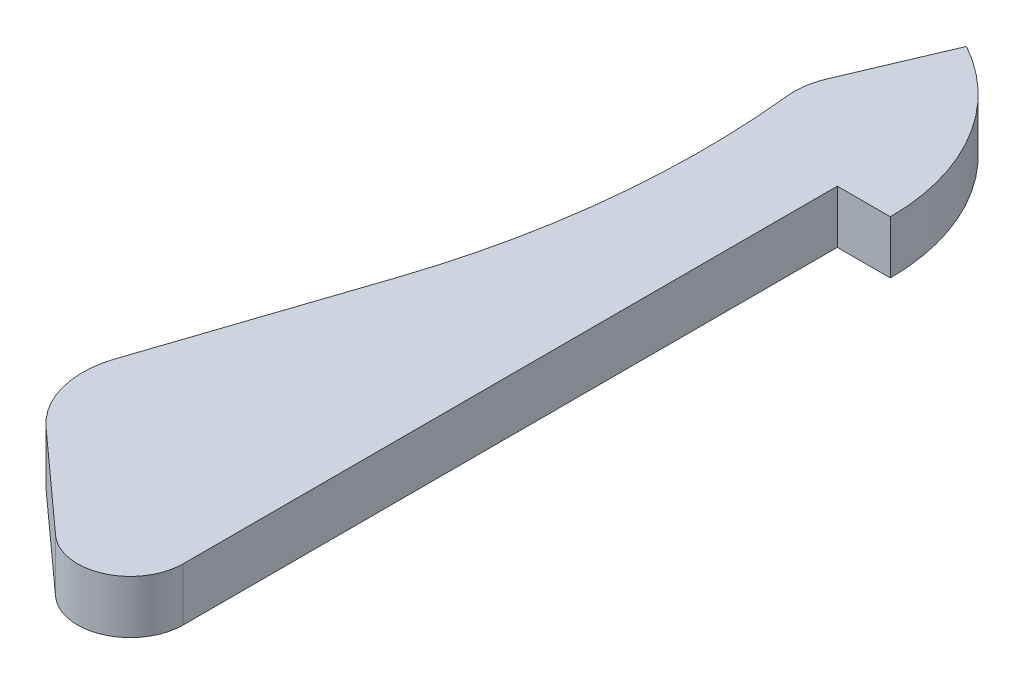
ISO-10303-21;
HEADER;
FILE_DESCRIPTION(('STEP AP214'),'2;1');
FILE_NAME('part.step','',(''),(''),'','','');
FILE_SCHEMA(('AUTOMOTIVE_DESIGN { 1 0 10303 214 1 1 1 1 }'));
ENDSEC;
DATA;
#1=APPLICATION_CONTEXT('core data for automotive mechanical design processes');
#2=APPLICATION_PROTOCOL_DEFINITION('international standard','automotive_design',2000,#1);
#3=PRODUCT_CONTEXT('',#1,'mechanical');
#4=PRODUCT('Part','Part','',(#3));
#5=PRODUCT_RELATED_PRODUCT_CATEGORY('part','',(#4));
#6=PRODUCT_DEFINITION_FORMATION('','',#4);
#7=PRODUCT_DEFINITION_CONTEXT('part definition',#1,'design');
#8=PRODUCT_DEFINITION('design','',#6,#7);
#9=PRODUCT_DEFINITION_SHAPE('','',#8);
#10=(LENGTH_UNIT() NAMED_UNIT(*) SI_UNIT(.MILLI.,.METRE.));
#11=(NAMED_UNIT(*) PLANE_ANGLE_UNIT() SI_UNIT($,.RADIAN.));
#12=(NAMED_UNIT(*) SI_UNIT($,.STERADIAN.) SOLID_ANGLE_UNIT());
#13=UNCERTAINTY_MEASURE_WITH_UNIT(LENGTH_MEASURE(1.E-05),#10,'distance_accuracy_value','');
#14=(GEOMETRIC_REPRESENTATION_CONTEXT(3) GLOBAL_UNCERTAINTY_ASSIGNED_CONTEXT((#13)) GLOBAL_UNIT_ASSIGNED_CONTEXT((#10,
#11,#12)) REPRESENTATION_CONTEXT('',''));
#15=CARTESIAN_POINT('',(0.,0.,0.));
#16=DIRECTION('',(0.,0.,1.));
#17=DIRECTION('',(1.,0.,0.));
#18=AXIS2_PLACEMENT_3D('',#15,#16,#17);
#19=CARTESIAN_POINT('',(0.,19.05,0.));
#20=DIRECTION('',(0.,0.,-1.));
#21=DIRECTION('',(-1.,0.,0.));
#22=AXIS2_PLACEMENT_3D('',#19,#20,#21);
#23=PLANE('',#22);
#24=DIRECTION('',(1.,0.,0.));
#25=VECTOR('',#24,1.);
#26=CARTESIAN_POINT('',(0.,0.,0.));
#27=LINE('',#26,#25);
#28=CARTESIAN_POINT('',(0.,0.,0.));
#29=VERTEX_POINT('',#28);
#30=CARTESIAN_POINT('',(19.05,0.,0.));
#31=VERTEX_POINT('',#30);
#32=EDGE_CURVE('E144',#29,#31,#27,.T.);
#33=ORIENTED_EDGE('',*,*,#32,.T.);
#34=DIRECTION('',(0.,-1.,0.));
#35=VECTOR('',#34,1.);
#36=CARTESIAN_POINT('',(19.05,19.05,0.));
#37=LINE('',#36,#35);
#38=CARTESIAN_POINT('',(19.05,19.05,0.));
#39=VERTEX_POINT('',#38);
#40=EDGE_CURVE('E11',#39,#31,#37,.T.);
#41=ORIENTED_EDGE('',*,*,#40,.F.);
#42=DIRECTION('',(1.,0.,0.));
#43=VECTOR('',#42,1.);
#44=CARTESIAN_POINT('',(0.,19.05,0.));
#45=LINE('',#44,#43);
#46=CARTESIAN_POINT('',(0.,19.05,0.));
#47=VERTEX_POINT('',#46);
#48=EDGE_CURVE('E163',#47,#39,#45,.T.);
#49=ORIENTED_EDGE('',*,*,#48,.F.);
#50=DIRECTION('',(0.,-1.,0.));
#51=VECTOR('',#50,1.);
#52=CARTESIAN_POINT('',(0.,19.05,0.));
#53=LINE('',#52,#51);
#54=EDGE_CURVE('E140',#47,#29,#53,.T.);
#55=ORIENTED_EDGE('',*,*,#54,.T.);
#56=EDGE_LOOP('',(#33,#41,#49,#55));
#57=FACE_BOUND('',#56,.T.);
#58=ADVANCED_FACE('F33',(#57),#23,.F.);
#59=CARTESIAN_POINT('',(-57.15,19.05,0.));
#60=DIRECTION('',(0.,-1.,0.));
#61=DIRECTION('',(0.,0.,-1.));
#62=AXIS2_PLACEMENT_3D('',#59,#60,#61);
#63=CYLINDRICAL_SURFACE('',#62,76.2);
#64=CARTESIAN_POINT('',(-57.15,0.,0.));
#65=DIRECTION('',(0.,1.,0.));
#66=DIRECTION('',(0.,0.,1.));
#67=AXIS2_PLACEMENT_3D('',#64,#65,#66);
#68=CIRCLE('',#67,76.2);
#69=CARTESIAN_POINT('',(-20.259833627042,0.,-66.6749999998161));
#70=VERTEX_POINT('',#69);
#71=EDGE_CURVE('E147',#31,#70,#68,.T.);
#72=ORIENTED_EDGE('',*,*,#71,.T.);
#73=DIRECTION('',(0.,-1.,0.));
#74=VECTOR('',#73,1.);
#75=CARTESIAN_POINT('',(-20.259833627042,19.05,-66.6749999998161));
#76=LINE('',#75,#74);
#77=CARTESIAN_POINT('',(-20.259833627042,19.05,-66.6749999998161));
#78=VERTEX_POINT('',#77);
#79=EDGE_CURVE('E41',#78,#70,#76,.T.);
#80=ORIENTED_EDGE('',*,*,#79,.F.);
#81=CARTESIAN_POINT('',(-57.15,19.05,0.));
#82=DIRECTION('',(0.,1.,0.));
#83=DIRECTION('',(0.,0.,1.));
#84=AXIS2_PLACEMENT_3D('',#81,#82,#83);
#85=CIRCLE('',#84,76.2);
#86=EDGE_CURVE('E99',#39,#78,#85,.T.);
#87=ORIENTED_EDGE('',*,*,#86,.F.);
#88=ORIENTED_EDGE('',*,*,#40,.T.);
#89=EDGE_LOOP('',(#72,#80,#87,#88));
#90=FACE_BOUND('',#89,.T.);
#91=ADVANCED_FACE('F254',(#90),#63,.T.);
#92=CARTESIAN_POINT('',(-20.259833627042,19.05,-66.6749999998161));
#93=DIRECTION('',(0.920287164315627,0.,0.391243575277475));
#94=DIRECTION('',(0.391243575277475,0.,-0.920287164315627));
#95=AXIS2_PLACEMENT_3D('',#92,#93,#94);
#96=PLANE('',#95);
#97=DIRECTION('',(-0.391243575277475,0.,0.920287164315627));
#98=VECTOR('',#97,1.);
#99=CARTESIAN_POINT('',(-20.259833627042,0.,-66.6749999998161));
#100=LINE('',#99,#98);
#101=CARTESIAN_POINT('',(-35.1662138451139,0.,-31.6120590393907));
#102=VERTEX_POINT('',#101);
#103=EDGE_CURVE('E150',#70,#102,#100,.T.);
#104=ORIENTED_EDGE('',*,*,#103,.T.);
#105=DIRECTION('',(0.,-1.,0.));
#106=VECTOR('',#105,1.);
#107=CARTESIAN_POINT('',(-35.1662138451139,19.05,-31.6120590393907));
#108=LINE('',#107,#106);
#109=CARTESIAN_POINT('',(-35.1662138451139,19.05,-31.6120590393907));
#110=VERTEX_POINT('',#109);
#111=EDGE_CURVE('E176',#110,#102,#108,.T.);
#112=ORIENTED_EDGE('',*,*,#111,.F.);
#113=DIRECTION('',(-0.391243575277475,0.,0.920287164315627));
#114=VECTOR('',#113,1.);
#115=CARTESIAN_POINT('',(-20.259833627042,19.05,-66.6749999998161));
#116=LINE('',#115,#114);
#117=EDGE_CURVE('E184',#78,#110,#116,.T.);
#118=ORIENTED_EDGE('',*,*,#117,.F.);
#119=ORIENTED_EDGE('',*,*,#79,.T.);
#120=EDGE_LOOP('',(#104,#112,#118,#119));
#121=FACE_BOUND('',#120,.T.);
#122=ADVANCED_FACE('F182',(#121),#96,.F.);
#123=CARTESIAN_POINT('',(-11.790919871497,19.05,-21.6744722273428));
#124=DIRECTION('',(0.,-1.,0.));
#125=DIRECTION('',(0.,0.,-1.));
#126=AXIS2_PLACEMENT_3D('',#123,#124,#125);
#127=CYLINDRICAL_SURFACE('',#126,25.4);
#128=CARTESIAN_POINT('',(-11.790919871497,0.,-21.6744722273428));
#129=DIRECTION('',(0.,1.,0.));
#130=DIRECTION('',(0.,0.,1.));
#131=AXIS2_PLACEMENT_3D('',#128,#129,#130);
#132=CIRCLE('',#131,25.4);
#133=CARTESIAN_POINT('',(-37.0485453596706,0.,-18.9888894788209));
#134=VERTEX_POINT('',#133);
#135=EDGE_CURVE('E152',#102,#134,#132,.T.);
#136=ORIENTED_EDGE('',*,*,#135,.T.);
#137=DIRECTION('',(0.,-1.,0.));
#138=VECTOR('',#137,1.);
#139=CARTESIAN_POINT('',(-37.0485453596706,19.05,-18.9888894788209));
#140=LINE('',#139,#138);
#141=CARTESIAN_POINT('',(-37.0485453596706,19.05,-18.9888894788209));
#142=VERTEX_POINT('',#141);
#143=EDGE_CURVE('E173',#142,#134,#140,.T.);
#144=ORIENTED_EDGE('',*,*,#143,.F.);
#145=CARTESIAN_POINT('',(-11.790919871497,19.05,-21.6744722273428));
#146=DIRECTION('',(0.,1.,0.));
#147=DIRECTION('',(0.,0.,1.));
#148=AXIS2_PLACEMENT_3D('',#145,#146,#147);
#149=CIRCLE('',#148,25.4);
#150=EDGE_CURVE('E202',#110,#142,#149,.T.);
#151=ORIENTED_EDGE('',*,*,#150,.F.);
#152=ORIENTED_EDGE('',*,*,#111,.T.);
#153=EDGE_LOOP('',(#136,#144,#151,#152));
#154=FACE_BOUND('',#153,.T.);
#155=ADVANCED_FACE('F193',(#154),#127,.T.);
#156=CARTESIAN_POINT('',(-336.194312345896,19.05,12.8185625513681));
#157=DIRECTION('',(0.,-1.,0.));
#158=DIRECTION('',(0.,0.,-1.));
#159=AXIS2_PLACEMENT_3D('',#156,#157,#158);
#160=CYLINDRICAL_SURFACE('',#159,300.832019423514);
#161=CARTESIAN_POINT('',(-336.194312345896,0.,12.8185625513681));
#162=DIRECTION('',(0.,-1.,0.));
#163=DIRECTION('',(0.,0.,1.));
#164=AXIS2_PLACEMENT_3D('',#161,#162,#163);
#165=CIRCLE('',#164,300.832019423514);
#166=CARTESIAN_POINT('',(-50.8,0.,107.95));
#167=VERTEX_POINT('',#166);
#168=EDGE_CURVE('E154',#134,#167,#165,.T.);
#169=ORIENTED_EDGE('',*,*,#168,.T.);
#170=DIRECTION('',(0.,-1.,0.));
#171=VECTOR('',#170,1.);
#172=CARTESIAN_POINT('',(-50.8,19.05,107.95));
#173=LINE('',#172,#171);
#174=CARTESIAN_POINT('',(-50.8,19.05,107.95));
#175=VERTEX_POINT('',#174);
#176=EDGE_CURVE('E170',#175,#167,#173,.T.);
#177=ORIENTED_EDGE('',*,*,#176,.F.);
#178=CARTESIAN_POINT('',(-336.194312345896,19.05,12.8185625513681));
#179=DIRECTION('',(0.,-1.,0.));
#180=DIRECTION('',(0.,0.,1.));
#181=AXIS2_PLACEMENT_3D('',#178,#179,#180);
#182=CIRCLE('',#181,300.832019423514);
#183=EDGE_CURVE('E199',#142,#175,#182,.T.);
#184=ORIENTED_EDGE('',*,*,#183,.F.);
#185=ORIENTED_EDGE('',*,*,#143,.T.);
#186=EDGE_LOOP('',(#169,#177,#184,#185));
#187=FACE_BOUND('',#186,.T.);
#188=ADVANCED_FACE('F197',(#187),#160,.F.);
#189=CARTESIAN_POINT('',(-75.9848700471077,19.05,183.504610141323));
#190=DIRECTION('',(0.948683298050514,0.,0.316227766016838));
#191=DIRECTION('',(0.316227766016838,0.,-0.948683298050514));
#192=AXIS2_PLACEMENT_3D('',#189,#190,#191);
#193=PLANE('',#192);
#194=DIRECTION('',(-0.316227766016838,0.,0.948683298050514));
#195=VECTOR('',#194,1.);
#196=CARTESIAN_POINT('',(-75.9848700471077,0.,183.504610141323));
#197=LINE('',#196,#195);
#198=CARTESIAN_POINT('',(-75.9848700471077,0.,183.504610141323));
#199=VERTEX_POINT('',#198);
#200=EDGE_CURVE('E156',#167,#199,#197,.T.);
#201=ORIENTED_EDGE('',*,*,#200,.T.);
#202=DIRECTION('',(0.,-1.,0.));
#203=VECTOR('',#202,1.);
#204=CARTESIAN_POINT('',(-75.9848700471077,19.05,183.504610141323));
#205=LINE('',#204,#203);
#206=CARTESIAN_POINT('',(-75.9848700471077,19.05,183.504610141323));
#207=VERTEX_POINT('',#206);
#208=EDGE_CURVE('E167',#207,#199,#205,.T.);
#209=ORIENTED_EDGE('',*,*,#208,.F.);
#210=DIRECTION('',(-0.316227766016838,0.,0.948683298050514));
#211=VECTOR('',#210,1.);
#212=CARTESIAN_POINT('',(-75.9848700471077,19.05,183.504610141323));
#213=LINE('',#212,#211);
#214=EDGE_CURVE('E201',#175,#207,#213,.T.);
#215=ORIENTED_EDGE('',*,*,#214,.F.);
#216=ORIENTED_EDGE('',*,*,#176,.T.);
#217=EDGE_LOOP('',(#201,#209,#215,#216));
#218=FACE_BOUND('',#217,.T.);
#219=ADVANCED_FACE('F266',(#218),#193,.F.);
#220=CARTESIAN_POINT('',(-45.8641753340039,19.05,193.544841712358));
#221=DIRECTION('',(0.,-1.,0.));
#222=DIRECTION('',(0.,0.,-1.));
#223=AXIS2_PLACEMENT_3D('',#220,#221,#222);
#224=CYLINDRICAL_SURFACE('',#223,31.75);
#225=CARTESIAN_POINT('',(-45.8641753340039,0.,193.544841712358));
#226=DIRECTION('',(0.,1.,0.));
#227=DIRECTION('',(0.,0.,-1.));
#228=AXIS2_PLACEMENT_3D('',#225,#226,#227);
#229=CIRCLE('',#228,31.75);
#230=CARTESIAN_POINT('',(-67.1399485298802,0.,217.111852021636));
#231=VERTEX_POINT('',#230);
#232=EDGE_CURVE('E158',#199,#231,#229,.T.);
#233=ORIENTED_EDGE('',*,*,#232,.T.);
#234=DIRECTION('',(0.,-1.,0.));
#235=VECTOR('',#234,1.);
#236=CARTESIAN_POINT('',(-67.1399485298802,19.05,217.111852021636));
#237=LINE('',#236,#235);
#238=CARTESIAN_POINT('',(-67.1399485298802,19.05,217.111852021636));
#239=VERTEX_POINT('',#238);
#240=EDGE_CURVE('E135',#239,#231,#237,.T.);
#241=ORIENTED_EDGE('',*,*,#240,.F.);
#242=CARTESIAN_POINT('',(-45.8641753340039,19.05,193.544841712358));
#243=DIRECTION('',(0.,1.,0.));
#244=DIRECTION('',(0.,0.,-1.));
#245=AXIS2_PLACEMENT_3D('',#242,#243,#244);
#246=CIRCLE('',#245,31.75);
#247=EDGE_CURVE('E126',#207,#239,#246,.T.);
#248=ORIENTED_EDGE('',*,*,#247,.F.);
#249=ORIENTED_EDGE('',*,*,#208,.T.);
#250=EDGE_LOOP('',(#233,#241,#248,#249));
#251=FACE_BOUND('',#250,.T.);
#252=ADVANCED_FACE('F263',(#251),#224,.T.);
#253=CARTESIAN_POINT('',(-31.75,19.05,249.061111111111));
#254=DIRECTION('',(0.670103092783505,0.,-0.742268041237114));
#255=DIRECTION('',(-0.742268041237114,0.,-0.670103092783505));
#256=AXIS2_PLACEMENT_3D('',#253,#254,#255);
#257=PLANE('',#256);
#258=DIRECTION('',(0.742268041237114,0.,0.670103092783505));
#259=VECTOR('',#258,1.);
#260=CARTESIAN_POINT('',(-31.75,0.,249.061111111111));
#261=LINE('',#260,#259);
#262=CARTESIAN_POINT('',(-31.75,0.,249.061111111111));
#263=VERTEX_POINT('',#262);
#264=EDGE_CURVE('E134',#231,#263,#261,.T.);
#265=ORIENTED_EDGE('',*,*,#264,.T.);
#266=DIRECTION('',(0.,-1.,0.));
#267=VECTOR('',#266,1.);
#268=CARTESIAN_POINT('',(-31.75,19.05,249.061111111111));
#269=LINE('',#268,#267);
#270=CARTESIAN_POINT('',(-31.75,19.05,249.061111111111));
#271=VERTEX_POINT('',#270);
#272=EDGE_CURVE('E131',#271,#263,#269,.T.);
#273=ORIENTED_EDGE('',*,*,#272,.F.);
#274=DIRECTION('',(0.742268041237114,0.,0.670103092783505));
#275=VECTOR('',#274,1.);
#276=CARTESIAN_POINT('',(-31.75,19.05,249.061111111111));
#277=LINE('',#276,#275);
#278=EDGE_CURVE('E120',#239,#271,#277,.T.);
#279=ORIENTED_EDGE('',*,*,#278,.F.);
#280=ORIENTED_EDGE('',*,*,#240,.T.);
#281=EDGE_LOOP('',(#265,#273,#279,#280));
#282=FACE_BOUND('',#281,.T.);
#283=ADVANCED_FACE('F132',(#282),#257,.F.);
#284=CARTESIAN_POINT('',(-19.0108024691358,19.05,234.95));
#285=DIRECTION('',(0.,-1.,0.));
#286=DIRECTION('',(0.,0.,-1.));
#287=AXIS2_PLACEMENT_3D('',#284,#285,#286);
#288=CYLINDRICAL_SURFACE('',#287,19.0108024691358);
#289=CARTESIAN_POINT('',(-19.0108024691358,0.,234.95));
#290=DIRECTION('',(0.,1.,0.));
#291=DIRECTION('',(0.,0.,-1.));
#292=AXIS2_PLACEMENT_3D('',#289,#290,#291);
#293=CIRCLE('',#292,19.0108024691358);
#294=CARTESIAN_POINT('',(0.,0.,234.95));
#295=VERTEX_POINT('',#294);
#296=EDGE_CURVE('E85',#263,#295,#293,.T.);
#297=ORIENTED_EDGE('',*,*,#296,.T.);
#298=DIRECTION('',(0.,-1.,0.));
#299=VECTOR('',#298,1.);
#300=CARTESIAN_POINT('',(0.,19.05,234.95));
#301=LINE('',#300,#299);
#302=CARTESIAN_POINT('',(0.,19.05,234.95));
#303=VERTEX_POINT('',#302);
#304=EDGE_CURVE('E136',#303,#295,#301,.T.);
#305=ORIENTED_EDGE('',*,*,#304,.F.);
#306=CARTESIAN_POINT('',(-19.0108024691358,19.05,234.95));
#307=DIRECTION('',(0.,1.,0.));
#308=DIRECTION('',(0.,0.,-1.));
#309=AXIS2_PLACEMENT_3D('',#306,#307,#308);
#310=CIRCLE('',#309,19.0108024691358);
#311=EDGE_CURVE('E124',#271,#303,#310,.T.);
#312=ORIENTED_EDGE('',*,*,#311,.F.);
#313=ORIENTED_EDGE('',*,*,#272,.T.);
#314=EDGE_LOOP('',(#297,#305,#312,#313));
#315=FACE_BOUND('',#314,.T.);
#316=ADVANCED_FACE('F138',(#315),#288,.T.);
#317=CARTESIAN_POINT('',(0.,19.05,0.));
#318=DIRECTION('',(-1.,0.,0.));
#319=DIRECTION('',(0.,0.,1.));
#320=AXIS2_PLACEMENT_3D('',#317,#318,#319);
#321=PLANE('',#320);
#322=DIRECTION('',(0.,0.,-1.));
#323=VECTOR('',#322,1.);
#324=CARTESIAN_POINT('',(0.,0.,0.));
#325=LINE('',#324,#323);
#326=EDGE_CURVE('E91',#295,#29,#325,.T.);
#327=ORIENTED_EDGE('',*,*,#326,.T.);
#328=ORIENTED_EDGE('',*,*,#54,.F.);
#329=DIRECTION('',(0.,0.,-1.));
#330=VECTOR('',#329,1.);
#331=CARTESIAN_POINT('',(0.,19.05,0.));
#332=LINE('',#331,#330);
#333=EDGE_CURVE('E49',#303,#47,#332,.T.);
#334=ORIENTED_EDGE('',*,*,#333,.F.);
#335=ORIENTED_EDGE('',*,*,#304,.T.);
#336=EDGE_LOOP('',(#327,#328,#334,#335));
#337=FACE_BOUND('',#336,.T.);
#338=ADVANCED_FACE('F318',(#337),#321,.F.);
#339=CARTESIAN_POINT('',(-57.15,19.05,0.));
#340=DIRECTION('',(0.,1.,0.));
#341=DIRECTION('',(0.,0.,1.));
#342=AXIS2_PLACEMENT_3D('',#339,#340,#341);
#343=PLANE('',#342);
#344=ORIENTED_EDGE('',*,*,#48,.T.);
#345=ORIENTED_EDGE('',*,*,#86,.T.);
#346=ORIENTED_EDGE('',*,*,#117,.T.);
#347=ORIENTED_EDGE('',*,*,#150,.T.);
#348=ORIENTED_EDGE('',*,*,#183,.T.);
#349=ORIENTED_EDGE('',*,*,#214,.T.);
#350=ORIENTED_EDGE('',*,*,#247,.T.);
#351=ORIENTED_EDGE('',*,*,#278,.T.);
#352=ORIENTED_EDGE('',*,*,#311,.T.);
#353=ORIENTED_EDGE('',*,*,#333,.T.);
#354=EDGE_LOOP('',(#344,#345,#346,#347,#348,#349,#350,#351,#352,#353));
#355=FACE_BOUND('',#354,.T.);
#356=ADVANCED_FACE('F122',(#355),#343,.T.);
#357=CARTESIAN_POINT('',(-57.15,0.,0.));
#358=DIRECTION('',(0.,1.,0.));
#359=DIRECTION('',(0.,0.,1.));
#360=AXIS2_PLACEMENT_3D('',#357,#358,#359);
#361=PLANE('',#360);
#362=CARTESIAN_POINT('',(-10.6442458776704,0.,-21.6744722273428));
#363=DIRECTION('',(0.,-1.,0.));
#364=DIRECTION('',(0.,0.,-1.));
#365=AXIS2_PLACEMENT_3D('',#362,#363,#364);
#366=CIRCLE('',#365,1.58749999999999);
#367=CARTESIAN_POINT('',(-10.6442458776704,0.,-23.2619722273428));
#368=VERTEX_POINT('',#367);
#369=EDGE_CURVE('E224',#368,#368,#366,.T.);
#370=ORIENTED_EDGE('',*,*,#369,.F.);
#371=EDGE_LOOP('',(#370));
#372=FACE_BOUND('',#371,.T.);
#373=CARTESIAN_POINT('',(-29.6333333333333,0.,133.35));
#374=DIRECTION('',(0.,-1.,0.));
#375=DIRECTION('',(0.,0.,-1.));
#376=AXIS2_PLACEMENT_3D('',#373,#374,#375);
#377=CIRCLE('',#376,1.58749999999999);
#378=CARTESIAN_POINT('',(-29.6333333333333,0.,131.7625));
#379=VERTEX_POINT('',#378);
#380=EDGE_CURVE('E218',#379,#379,#377,.T.);
#381=ORIENTED_EDGE('',*,*,#380,.F.);
#382=EDGE_LOOP('',(#381));
#383=FACE_BOUND('',#382,.T.);
#384=CARTESIAN_POINT('',(-22.234526543435,0.,227.696620832827));
#385=DIRECTION('',(0.,-1.,0.));
#386=DIRECTION('',(0.,0.,-1.));
#387=AXIS2_PLACEMENT_3D('',#384,#385,#386);
#388=CIRCLE('',#387,1.58749999999999);
#389=CARTESIAN_POINT('',(-22.234526543435,0.,226.109120832827));
#390=VERTEX_POINT('',#389);
#391=EDGE_CURVE('E212',#390,#390,#388,.T.);
#392=ORIENTED_EDGE('',*,*,#391,.F.);
#393=EDGE_LOOP('',(#392));
#394=FACE_BOUND('',#393,.T.);
#395=ORIENTED_EDGE('',*,*,#32,.F.);
#396=ORIENTED_EDGE('',*,*,#326,.F.);
#397=ORIENTED_EDGE('',*,*,#296,.F.);
#398=ORIENTED_EDGE('',*,*,#264,.F.);
#399=ORIENTED_EDGE('',*,*,#232,.F.);
#400=ORIENTED_EDGE('',*,*,#200,.F.);
#401=ORIENTED_EDGE('',*,*,#168,.F.);
#402=ORIENTED_EDGE('',*,*,#135,.F.);
#403=ORIENTED_EDGE('',*,*,#103,.F.);
#404=ORIENTED_EDGE('',*,*,#71,.F.);
#405=EDGE_LOOP('',(#395,#396,#397,#398,#399,#400,#401,#402,#403,#404));
#406=FACE_BOUND('',#405,.T.);
#407=ADVANCED_FACE('F188',(#372,#383,#394,#406),#361,.F.);
#408=CARTESIAN_POINT('',(-22.234526543435,11.1252,227.696620832827));
#409=DIRECTION('',(0.,-1.,0.));
#410=DIRECTION('',(0.,0.,-1.));
#411=AXIS2_PLACEMENT_3D('',#408,#409,#410);
#412=CONICAL_SURFACE('',#411,1.58749999999999,1.02974425867665);
#413=CARTESIAN_POINT('',(-22.234526543435,12.0790662327063,227.696620832827));
#414=VERTEX_POINT('',#413);
#415=VERTEX_LOOP('',#414);
#416=FACE_BOUND('',#415,.T.);
#417=CARTESIAN_POINT('',(-22.234526543435,11.1252,227.696620832827));
#418=DIRECTION('',(0.,-1.,0.));
#419=DIRECTION('',(0.,0.,-1.));
#420=AXIS2_PLACEMENT_3D('',#417,#418,#419);
#421=CIRCLE('',#420,1.58749999999999);
#422=CARTESIAN_POINT('',(-22.234526543435,11.1252,226.109120832827));
#423=VERTEX_POINT('',#422);
#424=EDGE_CURVE('E148',#423,#423,#421,.T.);
#425=ORIENTED_EDGE('',*,*,#424,.T.);
#426=EDGE_LOOP('',(#425));
#427=FACE_BOUND('',#426,.T.);
#428=ADVANCED_FACE('F232',(#416,#427),#412,.F.);
#429=CARTESIAN_POINT('',(-22.234526543435,0.,227.696620832827));
#430=DIRECTION('',(0.,-1.,0.));
#431=DIRECTION('',(0.,0.,-1.));
#432=AXIS2_PLACEMENT_3D('',#429,#430,#431);
#433=CYLINDRICAL_SURFACE('',#432,1.58749999999999);
#434=ORIENTED_EDGE('',*,*,#424,.F.);
#435=EDGE_LOOP('',(#434));
#436=FACE_BOUND('',#435,.T.);
#437=ORIENTED_EDGE('',*,*,#391,.T.);
#438=EDGE_LOOP('',(#437));
#439=FACE_BOUND('',#438,.T.);
#440=ADVANCED_FACE('F238',(#436,#439),#433,.F.);
#441=CARTESIAN_POINT('',(-29.6333333333333,11.1252,133.35));
#442=DIRECTION('',(0.,-1.,0.));
#443=DIRECTION('',(0.,0.,-1.));
#444=AXIS2_PLACEMENT_3D('',#441,#442,#443);
#445=CONICAL_SURFACE('',#444,1.58749999999999,1.02974425867665);
#446=CARTESIAN_POINT('',(-29.6333333333333,12.0790662327063,133.35));
#447=VERTEX_POINT('',#446);
#448=VERTEX_LOOP('',#447);
#449=FACE_BOUND('',#448,.T.);
#450=CARTESIAN_POINT('',(-29.6333333333333,11.1252,133.35));
#451=DIRECTION('',(0.,-1.,0.));
#452=DIRECTION('',(0.,0.,-1.));
#453=AXIS2_PLACEMENT_3D('',#450,#451,#452);
#454=CIRCLE('',#453,1.58749999999999);
#455=CARTESIAN_POINT('',(-29.6333333333333,11.1252,131.7625));
#456=VERTEX_POINT('',#455);
#457=EDGE_CURVE('E215',#456,#456,#454,.T.);
#458=ORIENTED_EDGE('',*,*,#457,.T.);
#459=EDGE_LOOP('',(#458));
#460=FACE_BOUND('',#459,.T.);
#461=ADVANCED_FACE('F240',(#449,#460),#445,.F.);
#462=CARTESIAN_POINT('',(-29.6333333333333,0.,133.35));
#463=DIRECTION('',(0.,-1.,0.));
#464=DIRECTION('',(0.,0.,-1.));
#465=AXIS2_PLACEMENT_3D('',#462,#463,#464);
#466=CYLINDRICAL_SURFACE('',#465,1.58749999999999);
#467=ORIENTED_EDGE('',*,*,#457,.F.);
#468=EDGE_LOOP('',(#467));
#469=FACE_BOUND('',#468,.T.);
#470=ORIENTED_EDGE('',*,*,#380,.T.);
#471=EDGE_LOOP('',(#470));
#472=FACE_BOUND('',#471,.T.);
#473=ADVANCED_FACE('F247',(#469,#472),#466,.F.);
#474=CARTESIAN_POINT('',(-10.6442458776704,11.1252,-21.6744722273428));
#475=DIRECTION('',(0.,-1.,0.));
#476=DIRECTION('',(0.,0.,-1.));
#477=AXIS2_PLACEMENT_3D('',#474,#475,#476);
#478=CONICAL_SURFACE('',#477,1.58749999999999,1.02974425867665);
#479=CARTESIAN_POINT('',(-10.6442458776705,12.0790662327063,-21.6744722273428));
#480=VERTEX_POINT('',#479);
#481=VERTEX_LOOP('',#480);
#482=FACE_BOUND('',#481,.T.);
#483=CARTESIAN_POINT('',(-10.6442458776704,11.1252,-21.6744722273428));
#484=DIRECTION('',(0.,-1.,0.));
#485=DIRECTION('',(0.,0.,-1.));
#486=AXIS2_PLACEMENT_3D('',#483,#484,#485);
#487=CIRCLE('',#486,1.58749999999999);
#488=CARTESIAN_POINT('',(-10.6442458776704,11.1252,-23.2619722273428));
#489=VERTEX_POINT('',#488);
#490=EDGE_CURVE('E221',#489,#489,#487,.T.);
#491=ORIENTED_EDGE('',*,*,#490,.T.);
#492=EDGE_LOOP('',(#491));
#493=FACE_BOUND('',#492,.T.);
#494=ADVANCED_FACE('F363',(#482,#493),#478,.F.);
#495=CARTESIAN_POINT('',(-10.6442458776704,0.,-21.6744722273428));
#496=DIRECTION('',(0.,-1.,0.));
#497=DIRECTION('',(0.,0.,-1.));
#498=AXIS2_PLACEMENT_3D('',#495,#496,#497);
#499=CYLINDRICAL_SURFACE('',#498,1.58749999999999);
#500=ORIENTED_EDGE('',*,*,#490,.F.);
#501=EDGE_LOOP('',(#500));
#502=FACE_BOUND('',#501,.T.);
#503=ORIENTED_EDGE('',*,*,#369,.T.);
#504=EDGE_LOOP('',(#503));
#505=FACE_BOUND('',#504,.T.);
#506=ADVANCED_FACE('F228',(#502,#505),#499,.F.);
#507=CLOSED_SHELL('',(#58,#91,#122,#155,#188,#219,#252,#283,#316,#338,#356,#407,#428,#440,#461,
#473,#494,#506));
#508=MANIFOLD_SOLID_BREP('B2',#507);
#509=ADVANCED_BREP_SHAPE_REPRESENTATION('',(#18,#508),#14);
#510=SHAPE_DEFINITION_REPRESENTATION(#9,#509);
ENDSEC;
END-ISO-10303-21;
